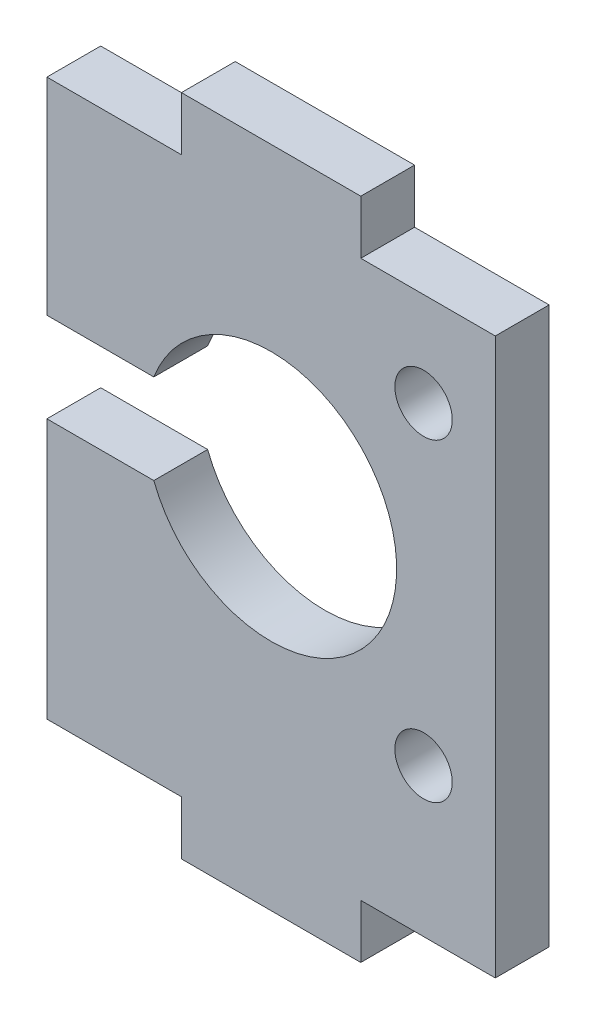
ISO-10303-21;
HEADER;
FILE_DESCRIPTION(('STEP AP214'),'2;1');
FILE_NAME('part.step','',(''),(''),'','','');
FILE_SCHEMA(('AUTOMOTIVE_DESIGN { 1 0 10303 214 1 1 1 1 }'));
ENDSEC;
DATA;
#1=APPLICATION_CONTEXT('core data for automotive mechanical design processes');
#2=APPLICATION_PROTOCOL_DEFINITION('international standard','automotive_design',2000,#1);
#3=PRODUCT_CONTEXT('',#1,'mechanical');
#4=PRODUCT('Part','Part','',(#3));
#5=PRODUCT_RELATED_PRODUCT_CATEGORY('part','',(#4));
#6=PRODUCT_DEFINITION_FORMATION('','',#4);
#7=PRODUCT_DEFINITION_CONTEXT('part definition',#1,'design');
#8=PRODUCT_DEFINITION('design','',#6,#7);
#9=PRODUCT_DEFINITION_SHAPE('','',#8);
#10=(LENGTH_UNIT() NAMED_UNIT(*) SI_UNIT(.MILLI.,.METRE.));
#11=(NAMED_UNIT(*) PLANE_ANGLE_UNIT() SI_UNIT($,.RADIAN.));
#12=(NAMED_UNIT(*) SI_UNIT($,.STERADIAN.) SOLID_ANGLE_UNIT());
#13=UNCERTAINTY_MEASURE_WITH_UNIT(LENGTH_MEASURE(1.E-05),#10,'distance_accuracy_value','');
#14=(GEOMETRIC_REPRESENTATION_CONTEXT(3) GLOBAL_UNCERTAINTY_ASSIGNED_CONTEXT((#13)) GLOBAL_UNIT_ASSIGNED_CONTEXT((#10,
#11,#12)) REPRESENTATION_CONTEXT('',''));
#15=CARTESIAN_POINT('',(0.,0.,0.));
#16=DIRECTION('',(0.,0.,1.));
#17=DIRECTION('',(1.,0.,0.));
#18=AXIS2_PLACEMENT_3D('',#15,#16,#17);
#19=CARTESIAN_POINT('',(0.,0.,-3.));
#20=DIRECTION('',(0.,0.,-1.));
#21=DIRECTION('',(-1.,0.,0.));
#22=AXIS2_PLACEMENT_3D('',#19,#20,#21);
#23=PLANE('',#22);
#24=CARTESIAN_POINT('',(8.5,-8.75,-3.));
#25=DIRECTION('',(0.,0.,-1.));
#26=DIRECTION('',(-1.,0.,0.));
#27=AXIS2_PLACEMENT_3D('',#24,#25,#26);
#28=CIRCLE('',#27,1.6);
#29=CARTESIAN_POINT('',(6.9,-8.75,-3.));
#30=VERTEX_POINT('',#29);
#31=EDGE_CURVE('E182',#30,#30,#28,.T.);
#32=ORIENTED_EDGE('',*,*,#31,.F.);
#33=EDGE_LOOP('',(#32));
#34=FACE_BOUND('',#33,.T.);
#35=DIRECTION('',(-1.,0.,0.));
#36=VECTOR('',#35,1.);
#37=CARTESIAN_POINT('',(5.,-17.,-3.));
#38=LINE('',#37,#36);
#39=CARTESIAN_POINT('',(12.5,-17.,-3.));
#40=VERTEX_POINT('',#39);
#41=CARTESIAN_POINT('',(5.,-17.,-3.));
#42=VERTEX_POINT('',#41);
#43=EDGE_CURVE('E209',#40,#42,#38,.T.);
#44=ORIENTED_EDGE('',*,*,#43,.T.);
#45=DIRECTION('',(0.,-1.,0.));
#46=VECTOR('',#45,1.);
#47=CARTESIAN_POINT('',(5.,-20.,-3.));
#48=LINE('',#47,#46);
#49=CARTESIAN_POINT('',(5.,-20.,-3.));
#50=VERTEX_POINT('',#49);
#51=EDGE_CURVE('E117',#42,#50,#48,.T.);
#52=ORIENTED_EDGE('',*,*,#51,.T.);
#53=DIRECTION('',(-1.,0.,0.));
#54=VECTOR('',#53,1.);
#55=CARTESIAN_POINT('',(-5.,-20.,-3.));
#56=LINE('',#55,#54);
#57=CARTESIAN_POINT('',(-5.,-20.,-3.));
#58=VERTEX_POINT('',#57);
#59=EDGE_CURVE('E248',#50,#58,#56,.T.);
#60=ORIENTED_EDGE('',*,*,#59,.T.);
#61=DIRECTION('',(0.,1.,0.));
#62=VECTOR('',#61,1.);
#63=CARTESIAN_POINT('',(-5.,-17.,-3.));
#64=LINE('',#63,#62);
#65=CARTESIAN_POINT('',(-5.,-17.,-3.));
#66=VERTEX_POINT('',#65);
#67=EDGE_CURVE('E267',#58,#66,#64,.T.);
#68=ORIENTED_EDGE('',*,*,#67,.T.);
#69=DIRECTION('',(-1.,0.,0.));
#70=VECTOR('',#69,1.);
#71=CARTESIAN_POINT('',(-12.5,-17.,-3.));
#72=LINE('',#71,#70);
#73=CARTESIAN_POINT('',(-12.5,-17.,-3.));
#74=VERTEX_POINT('',#73);
#75=EDGE_CURVE('E264',#66,#74,#72,.T.);
#76=ORIENTED_EDGE('',*,*,#75,.T.);
#77=DIRECTION('',(0.,1.,0.));
#78=VECTOR('',#77,1.);
#79=CARTESIAN_POINT('',(-12.5,-2.5,-3.));
#80=LINE('',#79,#78);
#81=CARTESIAN_POINT('',(-12.5,-2.5,-3.));
#82=VERTEX_POINT('',#81);
#83=EDGE_CURVE('E266',#74,#82,#80,.T.);
#84=ORIENTED_EDGE('',*,*,#83,.T.);
#85=DIRECTION('',(1.,0.,0.));
#86=VECTOR('',#85,1.);
#87=CARTESIAN_POINT('',(-12.5,-2.5,-3.));
#88=LINE('',#87,#86);
#89=CARTESIAN_POINT('',(-6.53834841531101,-2.5,-3.));
#90=VERTEX_POINT('',#89);
#91=EDGE_CURVE('E269',#82,#90,#88,.T.);
#92=ORIENTED_EDGE('',*,*,#91,.T.);
#93=CARTESIAN_POINT('',(0.,0.,-3.));
#94=DIRECTION('',(0.,0.,1.));
#95=DIRECTION('',(-1.,0.,0.));
#96=AXIS2_PLACEMENT_3D('',#93,#94,#95);
#97=CIRCLE('',#96,7.);
#98=CARTESIAN_POINT('',(-6.53834841531101,2.5,-3.));
#99=VERTEX_POINT('',#98);
#100=EDGE_CURVE('E275',#90,#99,#97,.T.);
#101=ORIENTED_EDGE('',*,*,#100,.T.);
#102=DIRECTION('',(-1.,0.,0.));
#103=VECTOR('',#102,1.);
#104=CARTESIAN_POINT('',(-12.5,2.5,-3.));
#105=LINE('',#104,#103);
#106=CARTESIAN_POINT('',(-12.5,2.5,-3.));
#107=VERTEX_POINT('',#106);
#108=EDGE_CURVE('E277',#99,#107,#105,.T.);
#109=ORIENTED_EDGE('',*,*,#108,.T.);
#110=DIRECTION('',(0.,1.,0.));
#111=VECTOR('',#110,1.);
#112=CARTESIAN_POINT('',(-12.5,14.,-3.));
#113=LINE('',#112,#111);
#114=CARTESIAN_POINT('',(-12.5,14.,-3.));
#115=VERTEX_POINT('',#114);
#116=EDGE_CURVE('E279',#107,#115,#113,.T.);
#117=ORIENTED_EDGE('',*,*,#116,.T.);
#118=DIRECTION('',(1.,0.,0.));
#119=VECTOR('',#118,1.);
#120=CARTESIAN_POINT('',(-12.5,14.,-3.));
#121=LINE('',#120,#119);
#122=CARTESIAN_POINT('',(-5.,14.,-3.));
#123=VERTEX_POINT('',#122);
#124=EDGE_CURVE('E281',#115,#123,#121,.T.);
#125=ORIENTED_EDGE('',*,*,#124,.T.);
#126=DIRECTION('',(0.,1.,0.));
#127=VECTOR('',#126,1.);
#128=CARTESIAN_POINT('',(-5.,14.,-3.));
#129=LINE('',#128,#127);
#130=CARTESIAN_POINT('',(-5.,17.,-3.));
#131=VERTEX_POINT('',#130);
#132=EDGE_CURVE('E283',#123,#131,#129,.T.);
#133=ORIENTED_EDGE('',*,*,#132,.T.);
#134=DIRECTION('',(1.,0.,0.));
#135=VECTOR('',#134,1.);
#136=CARTESIAN_POINT('',(-5.,17.,-3.));
#137=LINE('',#136,#135);
#138=CARTESIAN_POINT('',(5.,17.,-3.));
#139=VERTEX_POINT('',#138);
#140=EDGE_CURVE('E160',#131,#139,#137,.T.);
#141=ORIENTED_EDGE('',*,*,#140,.T.);
#142=DIRECTION('',(0.,-1.,0.));
#143=VECTOR('',#142,1.);
#144=CARTESIAN_POINT('',(5.,17.,-3.));
#145=LINE('',#144,#143);
#146=CARTESIAN_POINT('',(5.00000000000001,14.,-3.));
#147=VERTEX_POINT('',#146);
#148=EDGE_CURVE('E154',#139,#147,#145,.T.);
#149=ORIENTED_EDGE('',*,*,#148,.T.);
#150=DIRECTION('',(1.,0.,0.));
#151=VECTOR('',#150,1.);
#152=CARTESIAN_POINT('',(5.00000000000001,14.,-3.));
#153=LINE('',#152,#151);
#154=CARTESIAN_POINT('',(12.5,14.,-3.));
#155=VERTEX_POINT('',#154);
#156=EDGE_CURVE('E158',#147,#155,#153,.T.);
#157=ORIENTED_EDGE('',*,*,#156,.T.);
#158=DIRECTION('',(0.,-1.,0.));
#159=VECTOR('',#158,1.);
#160=CARTESIAN_POINT('',(12.5,14.,-3.));
#161=LINE('',#160,#159);
#162=EDGE_CURVE('E50',#155,#40,#161,.T.);
#163=ORIENTED_EDGE('',*,*,#162,.T.);
#164=EDGE_LOOP('',(#44,#52,#60,#68,#76,#84,#92,#101,#109,#117,#125,#133,#141,#149,#157,#163));
#165=FACE_BOUND('',#164,.T.);
#166=CARTESIAN_POINT('',(8.5,8.75,-3.));
#167=DIRECTION('',(0.,0.,-1.));
#168=DIRECTION('',(1.,0.,0.));
#169=AXIS2_PLACEMENT_3D('',#166,#167,#168);
#170=CIRCLE('',#169,1.6);
#171=CARTESIAN_POINT('',(10.1,8.75,-3.));
#172=VERTEX_POINT('',#171);
#173=EDGE_CURVE('E325',#172,#172,#170,.T.);
#174=ORIENTED_EDGE('',*,*,#173,.F.);
#175=EDGE_LOOP('',(#174));
#176=FACE_BOUND('',#175,.T.);
#177=ADVANCED_FACE('F33',(#34,#165,#176),#23,.T.);
#178=CARTESIAN_POINT('',(0.,0.,0.));
#179=DIRECTION('',(0.,0.,-1.));
#180=DIRECTION('',(-1.,0.,0.));
#181=AXIS2_PLACEMENT_3D('',#178,#179,#180);
#182=PLANE('',#181);
#183=DIRECTION('',(-1.,0.,0.));
#184=VECTOR('',#183,1.);
#185=CARTESIAN_POINT('',(5.,-17.,0.));
#186=LINE('',#185,#184);
#187=CARTESIAN_POINT('',(12.5,-17.,0.));
#188=VERTEX_POINT('',#187);
#189=CARTESIAN_POINT('',(5.,-17.,0.));
#190=VERTEX_POINT('',#189);
#191=EDGE_CURVE('E178',#188,#190,#186,.T.);
#192=ORIENTED_EDGE('',*,*,#191,.F.);
#193=DIRECTION('',(0.,-1.,0.));
#194=VECTOR('',#193,1.);
#195=CARTESIAN_POINT('',(12.5,14.,0.));
#196=LINE('',#195,#194);
#197=CARTESIAN_POINT('',(12.5,14.,0.));
#198=VERTEX_POINT('',#197);
#199=EDGE_CURVE('E109',#198,#188,#196,.T.);
#200=ORIENTED_EDGE('',*,*,#199,.F.);
#201=DIRECTION('',(1.,0.,0.));
#202=VECTOR('',#201,1.);
#203=CARTESIAN_POINT('',(5.00000000000001,14.,0.));
#204=LINE('',#203,#202);
#205=CARTESIAN_POINT('',(5.00000000000001,14.,0.));
#206=VERTEX_POINT('',#205);
#207=EDGE_CURVE('E103',#206,#198,#204,.T.);
#208=ORIENTED_EDGE('',*,*,#207,.F.);
#209=DIRECTION('',(0.,-1.,0.));
#210=VECTOR('',#209,1.);
#211=CARTESIAN_POINT('',(5.,17.,0.));
#212=LINE('',#211,#210);
#213=CARTESIAN_POINT('',(5.,17.,0.));
#214=VERTEX_POINT('',#213);
#215=EDGE_CURVE('E168',#214,#206,#212,.T.);
#216=ORIENTED_EDGE('',*,*,#215,.F.);
#217=DIRECTION('',(1.,0.,0.));
#218=VECTOR('',#217,1.);
#219=CARTESIAN_POINT('',(-5.,17.,0.));
#220=LINE('',#219,#218);
#221=CARTESIAN_POINT('',(-5.,17.,0.));
#222=VERTEX_POINT('',#221);
#223=EDGE_CURVE('E204',#222,#214,#220,.T.);
#224=ORIENTED_EDGE('',*,*,#223,.F.);
#225=DIRECTION('',(0.,1.,0.));
#226=VECTOR('',#225,1.);
#227=CARTESIAN_POINT('',(-5.,14.,0.));
#228=LINE('',#227,#226);
#229=CARTESIAN_POINT('',(-5.,14.,0.));
#230=VERTEX_POINT('',#229);
#231=EDGE_CURVE('E202',#230,#222,#228,.T.);
#232=ORIENTED_EDGE('',*,*,#231,.F.);
#233=DIRECTION('',(1.,0.,0.));
#234=VECTOR('',#233,1.);
#235=CARTESIAN_POINT('',(-12.5,14.,0.));
#236=LINE('',#235,#234);
#237=CARTESIAN_POINT('',(-12.5,14.,0.));
#238=VERTEX_POINT('',#237);
#239=EDGE_CURVE('E200',#238,#230,#236,.T.);
#240=ORIENTED_EDGE('',*,*,#239,.F.);
#241=DIRECTION('',(0.,1.,0.));
#242=VECTOR('',#241,1.);
#243=CARTESIAN_POINT('',(-12.5,14.,0.));
#244=LINE('',#243,#242);
#245=CARTESIAN_POINT('',(-12.5,2.5,0.));
#246=VERTEX_POINT('',#245);
#247=EDGE_CURVE('E198',#246,#238,#244,.T.);
#248=ORIENTED_EDGE('',*,*,#247,.F.);
#249=DIRECTION('',(-1.,0.,0.));
#250=VECTOR('',#249,1.);
#251=CARTESIAN_POINT('',(-12.5,2.5,0.));
#252=LINE('',#251,#250);
#253=CARTESIAN_POINT('',(-6.53834841531101,2.5,0.));
#254=VERTEX_POINT('',#253);
#255=EDGE_CURVE('E196',#254,#246,#252,.T.);
#256=ORIENTED_EDGE('',*,*,#255,.F.);
#257=CARTESIAN_POINT('',(0.,0.,0.));
#258=DIRECTION('',(0.,0.,1.));
#259=DIRECTION('',(-1.,0.,0.));
#260=AXIS2_PLACEMENT_3D('',#257,#258,#259);
#261=CIRCLE('',#260,7.);
#262=CARTESIAN_POINT('',(-6.53834841531101,-2.5,0.));
#263=VERTEX_POINT('',#262);
#264=EDGE_CURVE('E194',#263,#254,#261,.T.);
#265=ORIENTED_EDGE('',*,*,#264,.F.);
#266=DIRECTION('',(1.,0.,0.));
#267=VECTOR('',#266,1.);
#268=CARTESIAN_POINT('',(-12.5,-2.5,0.));
#269=LINE('',#268,#267);
#270=CARTESIAN_POINT('',(-12.5,-2.5,0.));
#271=VERTEX_POINT('',#270);
#272=EDGE_CURVE('E192',#271,#263,#269,.T.);
#273=ORIENTED_EDGE('',*,*,#272,.F.);
#274=DIRECTION('',(0.,1.,0.));
#275=VECTOR('',#274,1.);
#276=CARTESIAN_POINT('',(-12.5,-2.5,0.));
#277=LINE('',#276,#275);
#278=CARTESIAN_POINT('',(-12.5,-17.,0.));
#279=VERTEX_POINT('',#278);
#280=EDGE_CURVE('E190',#279,#271,#277,.T.);
#281=ORIENTED_EDGE('',*,*,#280,.F.);
#282=DIRECTION('',(-1.,0.,0.));
#283=VECTOR('',#282,1.);
#284=CARTESIAN_POINT('',(-12.5,-17.,0.));
#285=LINE('',#284,#283);
#286=CARTESIAN_POINT('',(-5.,-17.,0.));
#287=VERTEX_POINT('',#286);
#288=EDGE_CURVE('E188',#287,#279,#285,.T.);
#289=ORIENTED_EDGE('',*,*,#288,.F.);
#290=DIRECTION('',(0.,1.,0.));
#291=VECTOR('',#290,1.);
#292=CARTESIAN_POINT('',(-5.,-17.,0.));
#293=LINE('',#292,#291);
#294=CARTESIAN_POINT('',(-5.,-20.,0.));
#295=VERTEX_POINT('',#294);
#296=EDGE_CURVE('E186',#295,#287,#293,.T.);
#297=ORIENTED_EDGE('',*,*,#296,.F.);
#298=DIRECTION('',(-1.,0.,0.));
#299=VECTOR('',#298,1.);
#300=CARTESIAN_POINT('',(-5.,-20.,0.));
#301=LINE('',#300,#299);
#302=CARTESIAN_POINT('',(5.,-20.,0.));
#303=VERTEX_POINT('',#302);
#304=EDGE_CURVE('E184',#303,#295,#301,.T.);
#305=ORIENTED_EDGE('',*,*,#304,.F.);
#306=DIRECTION('',(0.,-1.,0.));
#307=VECTOR('',#306,1.);
#308=CARTESIAN_POINT('',(5.,-20.,0.));
#309=LINE('',#308,#307);
#310=EDGE_CURVE('E181',#190,#303,#309,.T.);
#311=ORIENTED_EDGE('',*,*,#310,.F.);
#312=EDGE_LOOP('',(#192,#200,#208,#216,#224,#232,#240,#248,#256,#265,#273,#281,#289,#297,#305,#311));
#313=FACE_BOUND('',#312,.T.);
#314=CARTESIAN_POINT('',(8.5,-8.75,0.));
#315=DIRECTION('',(0.,0.,-1.));
#316=DIRECTION('',(-1.,0.,0.));
#317=AXIS2_PLACEMENT_3D('',#314,#315,#316);
#318=CIRCLE('',#317,1.6);
#319=CARTESIAN_POINT('',(6.9,-8.75,0.));
#320=VERTEX_POINT('',#319);
#321=EDGE_CURVE('E331',#320,#320,#318,.T.);
#322=ORIENTED_EDGE('',*,*,#321,.T.);
#323=EDGE_LOOP('',(#322));
#324=FACE_BOUND('',#323,.T.);
#325=CARTESIAN_POINT('',(8.5,8.75,0.));
#326=DIRECTION('',(0.,0.,-1.));
#327=DIRECTION('',(1.,0.,0.));
#328=AXIS2_PLACEMENT_3D('',#325,#326,#327);
#329=CIRCLE('',#328,1.6);
#330=CARTESIAN_POINT('',(10.1,8.75,0.));
#331=VERTEX_POINT('',#330);
#332=EDGE_CURVE('E328',#331,#331,#329,.T.);
#333=ORIENTED_EDGE('',*,*,#332,.T.);
#334=EDGE_LOOP('',(#333));
#335=FACE_BOUND('',#334,.T.);
#336=ADVANCED_FACE('F252',(#313,#324,#335),#182,.F.);
#337=CARTESIAN_POINT('',(5.,-17.,-3.));
#338=DIRECTION('',(0.,1.,0.));
#339=DIRECTION('',(0.,0.,1.));
#340=AXIS2_PLACEMENT_3D('',#337,#338,#339);
#341=PLANE('',#340);
#342=ORIENTED_EDGE('',*,*,#191,.T.);
#343=DIRECTION('',(0.,0.,1.));
#344=VECTOR('',#343,1.);
#345=CARTESIAN_POINT('',(5.,-17.,-3.));
#346=LINE('',#345,#344);
#347=EDGE_CURVE('E11',#42,#190,#346,.T.);
#348=ORIENTED_EDGE('',*,*,#347,.F.);
#349=ORIENTED_EDGE('',*,*,#43,.F.);
#350=DIRECTION('',(0.,0.,1.));
#351=VECTOR('',#350,1.);
#352=CARTESIAN_POINT('',(12.5,-17.,-3.));
#353=LINE('',#352,#351);
#354=EDGE_CURVE('E174',#40,#188,#353,.T.);
#355=ORIENTED_EDGE('',*,*,#354,.T.);
#356=EDGE_LOOP('',(#342,#348,#349,#355));
#357=FACE_BOUND('',#356,.T.);
#358=ADVANCED_FACE('F35',(#357),#341,.F.);
#359=CARTESIAN_POINT('',(5.,-20.,-3.));
#360=DIRECTION('',(-1.,0.,0.));
#361=DIRECTION('',(0.,-1.,0.));
#362=AXIS2_PLACEMENT_3D('',#359,#360,#361);
#363=PLANE('',#362);
#364=ORIENTED_EDGE('',*,*,#310,.T.);
#365=DIRECTION('',(0.,0.,1.));
#366=VECTOR('',#365,1.);
#367=CARTESIAN_POINT('',(5.,-20.,-3.));
#368=LINE('',#367,#366);
#369=EDGE_CURVE('E42',#50,#303,#368,.T.);
#370=ORIENTED_EDGE('',*,*,#369,.F.);
#371=ORIENTED_EDGE('',*,*,#51,.F.);
#372=ORIENTED_EDGE('',*,*,#347,.T.);
#373=EDGE_LOOP('',(#364,#370,#371,#372));
#374=FACE_BOUND('',#373,.T.);
#375=ADVANCED_FACE('F464',(#374),#363,.F.);
#376=CARTESIAN_POINT('',(-5.,-20.,-3.));
#377=DIRECTION('',(0.,1.,0.));
#378=DIRECTION('',(0.,0.,1.));
#379=AXIS2_PLACEMENT_3D('',#376,#377,#378);
#380=PLANE('',#379);
#381=ORIENTED_EDGE('',*,*,#304,.T.);
#382=DIRECTION('',(0.,0.,1.));
#383=VECTOR('',#382,1.);
#384=CARTESIAN_POINT('',(-5.,-20.,-3.));
#385=LINE('',#384,#383);
#386=EDGE_CURVE('E240',#58,#295,#385,.T.);
#387=ORIENTED_EDGE('',*,*,#386,.F.);
#388=ORIENTED_EDGE('',*,*,#59,.F.);
#389=ORIENTED_EDGE('',*,*,#369,.T.);
#390=EDGE_LOOP('',(#381,#387,#388,#389));
#391=FACE_BOUND('',#390,.T.);
#392=ADVANCED_FACE('F246',(#391),#380,.F.);
#393=CARTESIAN_POINT('',(-5.,-17.,-3.));
#394=DIRECTION('',(1.,0.,0.));
#395=DIRECTION('',(0.,0.,-1.));
#396=AXIS2_PLACEMENT_3D('',#393,#394,#395);
#397=PLANE('',#396);
#398=ORIENTED_EDGE('',*,*,#296,.T.);
#399=DIRECTION('',(0.,0.,1.));
#400=VECTOR('',#399,1.);
#401=CARTESIAN_POINT('',(-5.,-17.,-3.));
#402=LINE('',#401,#400);
#403=EDGE_CURVE('E237',#66,#287,#402,.T.);
#404=ORIENTED_EDGE('',*,*,#403,.F.);
#405=ORIENTED_EDGE('',*,*,#67,.F.);
#406=ORIENTED_EDGE('',*,*,#386,.T.);
#407=EDGE_LOOP('',(#398,#404,#405,#406));
#408=FACE_BOUND('',#407,.T.);
#409=ADVANCED_FACE('F258',(#408),#397,.F.);
#410=CARTESIAN_POINT('',(-12.5,-17.,-3.));
#411=DIRECTION('',(0.,1.,0.));
#412=DIRECTION('',(0.,0.,1.));
#413=AXIS2_PLACEMENT_3D('',#410,#411,#412);
#414=PLANE('',#413);
#415=ORIENTED_EDGE('',*,*,#288,.T.);
#416=DIRECTION('',(0.,0.,1.));
#417=VECTOR('',#416,1.);
#418=CARTESIAN_POINT('',(-12.5,-17.,-3.));
#419=LINE('',#418,#417);
#420=EDGE_CURVE('E234',#74,#279,#419,.T.);
#421=ORIENTED_EDGE('',*,*,#420,.F.);
#422=ORIENTED_EDGE('',*,*,#75,.F.);
#423=ORIENTED_EDGE('',*,*,#403,.T.);
#424=EDGE_LOOP('',(#415,#421,#422,#423));
#425=FACE_BOUND('',#424,.T.);
#426=ADVANCED_FACE('F262',(#425),#414,.F.);
#427=CARTESIAN_POINT('',(-12.5,-2.5,-3.));
#428=DIRECTION('',(1.,0.,0.));
#429=DIRECTION('',(0.,1.,0.));
#430=AXIS2_PLACEMENT_3D('',#427,#428,#429);
#431=PLANE('',#430);
#432=ORIENTED_EDGE('',*,*,#280,.T.);
#433=DIRECTION('',(0.,0.,1.));
#434=VECTOR('',#433,1.);
#435=CARTESIAN_POINT('',(-12.5,-2.5,-3.));
#436=LINE('',#435,#434);
#437=EDGE_CURVE('E231',#82,#271,#436,.T.);
#438=ORIENTED_EDGE('',*,*,#437,.F.);
#439=ORIENTED_EDGE('',*,*,#83,.F.);
#440=ORIENTED_EDGE('',*,*,#420,.T.);
#441=EDGE_LOOP('',(#432,#438,#439,#440));
#442=FACE_BOUND('',#441,.T.);
#443=ADVANCED_FACE('F429',(#442),#431,.F.);
#444=CARTESIAN_POINT('',(-12.5,-2.5,-3.));
#445=DIRECTION('',(0.,-1.,0.));
#446=DIRECTION('',(1.,0.,0.));
#447=AXIS2_PLACEMENT_3D('',#444,#445,#446);
#448=PLANE('',#447);
#449=ORIENTED_EDGE('',*,*,#272,.T.);
#450=DIRECTION('',(0.,0.,1.));
#451=VECTOR('',#450,1.);
#452=CARTESIAN_POINT('',(-6.53834841531101,-2.5,-3.));
#453=LINE('',#452,#451);
#454=EDGE_CURVE('E228',#90,#263,#453,.T.);
#455=ORIENTED_EDGE('',*,*,#454,.F.);
#456=ORIENTED_EDGE('',*,*,#91,.F.);
#457=ORIENTED_EDGE('',*,*,#437,.T.);
#458=EDGE_LOOP('',(#449,#455,#456,#457));
#459=FACE_BOUND('',#458,.T.);
#460=ADVANCED_FACE('F419',(#459),#448,.F.);
#461=CARTESIAN_POINT('',(0.,0.,-3.));
#462=DIRECTION('',(0.,0.,1.));
#463=DIRECTION('',(1.,0.,0.));
#464=AXIS2_PLACEMENT_3D('',#461,#462,#463);
#465=CYLINDRICAL_SURFACE('',#464,7.);
#466=ORIENTED_EDGE('',*,*,#264,.T.);
#467=DIRECTION('',(0.,0.,1.));
#468=VECTOR('',#467,1.);
#469=CARTESIAN_POINT('',(-6.53834841531101,2.5,-3.));
#470=LINE('',#469,#468);
#471=EDGE_CURVE('E225',#99,#254,#470,.T.);
#472=ORIENTED_EDGE('',*,*,#471,.F.);
#473=ORIENTED_EDGE('',*,*,#100,.F.);
#474=ORIENTED_EDGE('',*,*,#454,.T.);
#475=EDGE_LOOP('',(#466,#472,#473,#474));
#476=FACE_BOUND('',#475,.T.);
#477=ADVANCED_FACE('F409',(#476),#465,.F.);
#478=CARTESIAN_POINT('',(-12.5,2.5,-3.));
#479=DIRECTION('',(0.,1.,0.));
#480=DIRECTION('',(-1.,0.,0.));
#481=AXIS2_PLACEMENT_3D('',#478,#479,#480);
#482=PLANE('',#481);
#483=ORIENTED_EDGE('',*,*,#255,.T.);
#484=DIRECTION('',(0.,0.,1.));
#485=VECTOR('',#484,1.);
#486=CARTESIAN_POINT('',(-12.5,2.5,-3.));
#487=LINE('',#486,#485);
#488=EDGE_CURVE('E222',#107,#246,#487,.T.);
#489=ORIENTED_EDGE('',*,*,#488,.F.);
#490=ORIENTED_EDGE('',*,*,#108,.F.);
#491=ORIENTED_EDGE('',*,*,#471,.T.);
#492=EDGE_LOOP('',(#483,#489,#490,#491));
#493=FACE_BOUND('',#492,.T.);
#494=ADVANCED_FACE('F399',(#493),#482,.F.);
#495=CARTESIAN_POINT('',(-12.5,14.,-3.));
#496=DIRECTION('',(1.,0.,0.));
#497=DIRECTION('',(0.,1.,0.));
#498=AXIS2_PLACEMENT_3D('',#495,#496,#497);
#499=PLANE('',#498);
#500=ORIENTED_EDGE('',*,*,#247,.T.);
#501=DIRECTION('',(0.,0.,1.));
#502=VECTOR('',#501,1.);
#503=CARTESIAN_POINT('',(-12.5,14.,-3.));
#504=LINE('',#503,#502);
#505=EDGE_CURVE('E219',#115,#238,#504,.T.);
#506=ORIENTED_EDGE('',*,*,#505,.F.);
#507=ORIENTED_EDGE('',*,*,#116,.F.);
#508=ORIENTED_EDGE('',*,*,#488,.T.);
#509=EDGE_LOOP('',(#500,#506,#507,#508));
#510=FACE_BOUND('',#509,.T.);
#511=ADVANCED_FACE('F389',(#510),#499,.F.);
#512=CARTESIAN_POINT('',(-12.5,14.,-3.));
#513=DIRECTION('',(0.,-1.,0.));
#514=DIRECTION('',(0.,0.,-1.));
#515=AXIS2_PLACEMENT_3D('',#512,#513,#514);
#516=PLANE('',#515);
#517=ORIENTED_EDGE('',*,*,#239,.T.);
#518=DIRECTION('',(0.,0.,1.));
#519=VECTOR('',#518,1.);
#520=CARTESIAN_POINT('',(-5.,14.,-3.));
#521=LINE('',#520,#519);
#522=EDGE_CURVE('E216',#123,#230,#521,.T.);
#523=ORIENTED_EDGE('',*,*,#522,.F.);
#524=ORIENTED_EDGE('',*,*,#124,.F.);
#525=ORIENTED_EDGE('',*,*,#505,.T.);
#526=EDGE_LOOP('',(#517,#523,#524,#525));
#527=FACE_BOUND('',#526,.T.);
#528=ADVANCED_FACE('F380',(#527),#516,.F.);
#529=CARTESIAN_POINT('',(-5.,14.,-3.));
#530=DIRECTION('',(1.,0.,0.));
#531=DIRECTION('',(0.,1.,0.));
#532=AXIS2_PLACEMENT_3D('',#529,#530,#531);
#533=PLANE('',#532);
#534=ORIENTED_EDGE('',*,*,#231,.T.);
#535=DIRECTION('',(0.,0.,1.));
#536=VECTOR('',#535,1.);
#537=CARTESIAN_POINT('',(-5.,17.,-3.));
#538=LINE('',#537,#536);
#539=EDGE_CURVE('E213',#131,#222,#538,.T.);
#540=ORIENTED_EDGE('',*,*,#539,.F.);
#541=ORIENTED_EDGE('',*,*,#132,.F.);
#542=ORIENTED_EDGE('',*,*,#522,.T.);
#543=EDGE_LOOP('',(#534,#540,#541,#542));
#544=FACE_BOUND('',#543,.T.);
#545=ADVANCED_FACE('F289',(#544),#533,.F.);
#546=CARTESIAN_POINT('',(-5.,17.,-3.));
#547=DIRECTION('',(0.,-1.,0.));
#548=DIRECTION('',(0.,0.,-1.));
#549=AXIS2_PLACEMENT_3D('',#546,#547,#548);
#550=PLANE('',#549);
#551=ORIENTED_EDGE('',*,*,#223,.T.);
#552=DIRECTION('',(0.,0.,1.));
#553=VECTOR('',#552,1.);
#554=CARTESIAN_POINT('',(5.,17.,-3.));
#555=LINE('',#554,#553);
#556=EDGE_CURVE('E169',#139,#214,#555,.T.);
#557=ORIENTED_EDGE('',*,*,#556,.F.);
#558=ORIENTED_EDGE('',*,*,#140,.F.);
#559=ORIENTED_EDGE('',*,*,#539,.T.);
#560=EDGE_LOOP('',(#551,#557,#558,#559));
#561=FACE_BOUND('',#560,.T.);
#562=ADVANCED_FACE('F293',(#561),#550,.F.);
#563=CARTESIAN_POINT('',(5.,17.,-3.));
#564=DIRECTION('',(-1.,0.,0.));
#565=DIRECTION('',(0.,-1.,0.));
#566=AXIS2_PLACEMENT_3D('',#563,#564,#565);
#567=PLANE('',#566);
#568=ORIENTED_EDGE('',*,*,#215,.T.);
#569=DIRECTION('',(0.,0.,1.));
#570=VECTOR('',#569,1.);
#571=CARTESIAN_POINT('',(5.00000000000001,14.,-3.));
#572=LINE('',#571,#570);
#573=EDGE_CURVE('E165',#147,#206,#572,.T.);
#574=ORIENTED_EDGE('',*,*,#573,.F.);
#575=ORIENTED_EDGE('',*,*,#148,.F.);
#576=ORIENTED_EDGE('',*,*,#556,.T.);
#577=EDGE_LOOP('',(#568,#574,#575,#576));
#578=FACE_BOUND('',#577,.T.);
#579=ADVANCED_FACE('F166',(#578),#567,.F.);
#580=CARTESIAN_POINT('',(5.00000000000001,14.,-3.));
#581=DIRECTION('',(0.,-1.,0.));
#582=DIRECTION('',(0.,0.,-1.));
#583=AXIS2_PLACEMENT_3D('',#580,#581,#582);
#584=PLANE('',#583);
#585=ORIENTED_EDGE('',*,*,#207,.T.);
#586=DIRECTION('',(0.,0.,1.));
#587=VECTOR('',#586,1.);
#588=CARTESIAN_POINT('',(12.5,14.,-3.));
#589=LINE('',#588,#587);
#590=EDGE_CURVE('E170',#155,#198,#589,.T.);
#591=ORIENTED_EDGE('',*,*,#590,.F.);
#592=ORIENTED_EDGE('',*,*,#156,.F.);
#593=ORIENTED_EDGE('',*,*,#573,.T.);
#594=EDGE_LOOP('',(#585,#591,#592,#593));
#595=FACE_BOUND('',#594,.T.);
#596=ADVANCED_FACE('F172',(#595),#584,.F.);
#597=CARTESIAN_POINT('',(12.5,14.,-3.));
#598=DIRECTION('',(-1.,0.,0.));
#599=DIRECTION('',(0.,0.,1.));
#600=AXIS2_PLACEMENT_3D('',#597,#598,#599);
#601=PLANE('',#600);
#602=ORIENTED_EDGE('',*,*,#199,.T.);
#603=ORIENTED_EDGE('',*,*,#354,.F.);
#604=ORIENTED_EDGE('',*,*,#162,.F.);
#605=ORIENTED_EDGE('',*,*,#590,.T.);
#606=EDGE_LOOP('',(#602,#603,#604,#605));
#607=FACE_BOUND('',#606,.T.);
#608=ADVANCED_FACE('F297',(#607),#601,.F.);
#609=CARTESIAN_POINT('',(8.5,-8.75,-3.));
#610=DIRECTION('',(0.,0.,1.));
#611=DIRECTION('',(1.,0.,0.));
#612=AXIS2_PLACEMENT_3D('',#609,#610,#611);
#613=CYLINDRICAL_SURFACE('',#612,1.6);
#614=ORIENTED_EDGE('',*,*,#31,.T.);
#615=EDGE_LOOP('',(#614));
#616=FACE_BOUND('',#615,.T.);
#617=ORIENTED_EDGE('',*,*,#321,.F.);
#618=EDGE_LOOP('',(#617));
#619=FACE_BOUND('',#618,.T.);
#620=ADVANCED_FACE('F299',(#616,#619),#613,.F.);
#621=CARTESIAN_POINT('',(8.5,8.75,-3.));
#622=DIRECTION('',(0.,0.,1.));
#623=DIRECTION('',(1.,0.,0.));
#624=AXIS2_PLACEMENT_3D('',#621,#622,#623);
#625=CYLINDRICAL_SURFACE('',#624,1.6);
#626=ORIENTED_EDGE('',*,*,#173,.T.);
#627=EDGE_LOOP('',(#626));
#628=FACE_BOUND('',#627,.T.);
#629=ORIENTED_EDGE('',*,*,#332,.F.);
#630=EDGE_LOOP('',(#629));
#631=FACE_BOUND('',#630,.T.);
#632=ADVANCED_FACE('F305',(#628,#631),#625,.F.);
#633=CLOSED_SHELL('',(#177,#336,#358,#375,#392,#409,#426,#443,#460,#477,#494,#511,#528,#545,
#562,#579,#596,#608,#620,#632));
#634=MANIFOLD_SOLID_BREP('B2',#633);
#635=ADVANCED_BREP_SHAPE_REPRESENTATION('',(#18,#634),#14);
#636=SHAPE_DEFINITION_REPRESENTATION(#9,#635);
ENDSEC;
END-ISO-10303-21;
